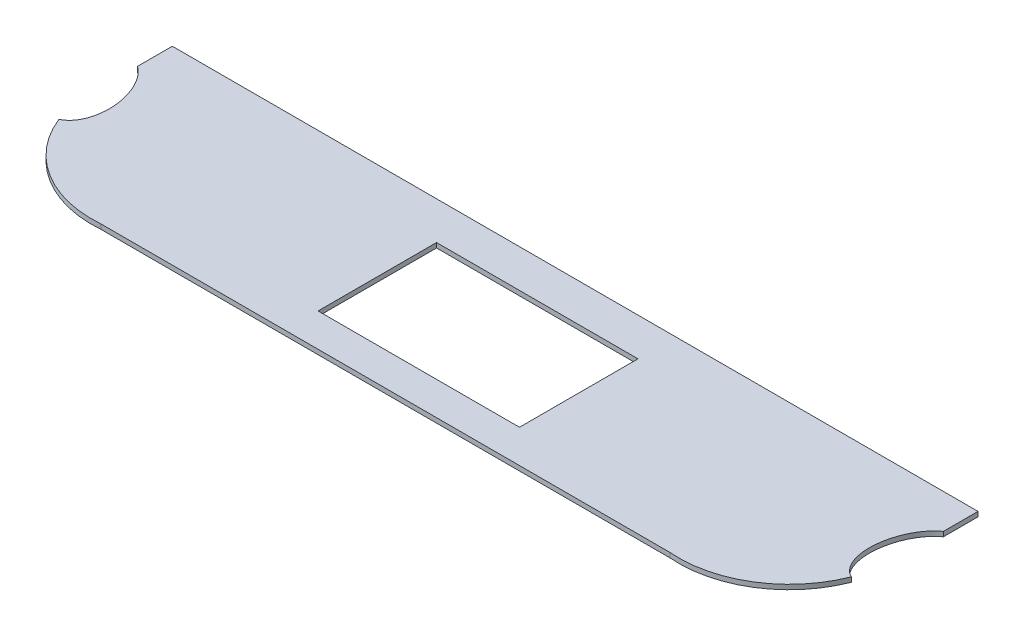
ISO-10303-21;
HEADER;
FILE_DESCRIPTION(('STEP AP214'),'2;1');
FILE_NAME('part.step','',(''),(''),'','','');
FILE_SCHEMA(('AUTOMOTIVE_DESIGN { 1 0 10303 214 1 1 1 1 }'));
ENDSEC;
DATA;
#1=APPLICATION_CONTEXT('core data for automotive mechanical design processes');
#2=APPLICATION_PROTOCOL_DEFINITION('international standard','automotive_design',2000,#1);
#3=PRODUCT_CONTEXT('',#1,'mechanical');
#4=PRODUCT('Part','Part','',(#3));
#5=PRODUCT_RELATED_PRODUCT_CATEGORY('part','',(#4));
#6=PRODUCT_DEFINITION_FORMATION('','',#4);
#7=PRODUCT_DEFINITION_CONTEXT('part definition',#1,'design');
#8=PRODUCT_DEFINITION('design','',#6,#7);
#9=PRODUCT_DEFINITION_SHAPE('','',#8);
#10=(LENGTH_UNIT() NAMED_UNIT(*) SI_UNIT(.MILLI.,.METRE.));
#11=(NAMED_UNIT(*) PLANE_ANGLE_UNIT() SI_UNIT($,.RADIAN.));
#12=(NAMED_UNIT(*) SI_UNIT($,.STERADIAN.) SOLID_ANGLE_UNIT());
#13=UNCERTAINTY_MEASURE_WITH_UNIT(LENGTH_MEASURE(1.E-05),#10,'distance_accuracy_value','');
#14=(GEOMETRIC_REPRESENTATION_CONTEXT(3) GLOBAL_UNCERTAINTY_ASSIGNED_CONTEXT((#13)) GLOBAL_UNIT_ASSIGNED_CONTEXT((#10,
#11,#12)) REPRESENTATION_CONTEXT('',''));
#15=CARTESIAN_POINT('',(0.,0.,0.));
#16=DIRECTION('',(0.,0.,1.));
#17=DIRECTION('',(1.,0.,0.));
#18=AXIS2_PLACEMENT_3D('',#15,#16,#17);
#19=CARTESIAN_POINT('',(157.295067766693,2.54,6.44379470696514));
#20=DIRECTION('',(0.,-1.,0.));
#21=DIRECTION('',(0.,0.,-1.));
#22=AXIS2_PLACEMENT_3D('',#19,#20,#21);
#23=CYLINDRICAL_SURFACE('',#22,59.17148954283);
#24=DIRECTION('',(0.,1.,0.));
#25=VECTOR('',#24,1.);
#26=CARTESIAN_POINT('',(212.346855170093,0.,28.1363251819493));
#27=LINE('',#26,#25);
#28=CARTESIAN_POINT('',(212.346855170093,0.,28.1363251819493));
#29=VERTEX_POINT('',#28);
#30=CARTESIAN_POINT('',(212.346855170093,2.54,28.1363251819493));
#31=VERTEX_POINT('',#30);
#32=EDGE_CURVE('E56',#29,#31,#27,.T.);
#33=ORIENTED_EDGE('',*,*,#32,.T.);
#34=CARTESIAN_POINT('',(157.295067766693,2.54,6.44379470696514));
#35=DIRECTION('',(0.,1.,0.));
#36=DIRECTION('',(0.,0.,-1.));
#37=AXIS2_PLACEMENT_3D('',#34,#35,#36);
#38=CIRCLE('',#37,59.17148954283);
#39=CARTESIAN_POINT('',(152.4,2.54,65.4124599985988));
#40=VERTEX_POINT('',#39);
#41=EDGE_CURVE('E156',#40,#31,#38,.T.);
#42=ORIENTED_EDGE('',*,*,#41,.F.);
#43=DIRECTION('',(0.,-1.,0.));
#44=VECTOR('',#43,1.);
#45=CARTESIAN_POINT('',(152.4,2.54,65.4124599985988));
#46=LINE('',#45,#44);
#47=CARTESIAN_POINT('',(152.4,0.,65.4124599985988));
#48=VERTEX_POINT('',#47);
#49=EDGE_CURVE('E157',#40,#48,#46,.T.);
#50=ORIENTED_EDGE('',*,*,#49,.T.);
#51=CARTESIAN_POINT('',(157.295067766693,0.,6.44379470696514));
#52=DIRECTION('',(0.,1.,0.));
#53=DIRECTION('',(0.,0.,-1.));
#54=AXIS2_PLACEMENT_3D('',#51,#52,#53);
#55=CIRCLE('',#54,59.17148954283);
#56=EDGE_CURVE('E142',#48,#29,#55,.T.);
#57=ORIENTED_EDGE('',*,*,#56,.T.);
#58=EDGE_LOOP('',(#33,#42,#50,#57));
#59=FACE_BOUND('',#58,.T.);
#60=ADVANCED_FACE('F34',(#59),#23,.T.);
#61=CARTESIAN_POINT('',(215.9,2.54,14.6124599985988));
#62=DIRECTION('',(-1.,0.,0.));
#63=DIRECTION('',(0.,0.,1.));
#64=AXIS2_PLACEMENT_3D('',#61,#62,#63);
#65=PLANE('',#64);
#66=DIRECTION('',(0.,1.,0.));
#67=VECTOR('',#66,1.);
#68=CARTESIAN_POINT('',(215.9,0.,-17.6025960449302));
#69=LINE('',#68,#67);
#70=CARTESIAN_POINT('',(215.9,0.,-17.6025960449302));
#71=VERTEX_POINT('',#70);
#72=CARTESIAN_POINT('',(215.9,2.54,-17.6025960449302));
#73=VERTEX_POINT('',#72);
#74=EDGE_CURVE('E122',#71,#73,#69,.T.);
#75=ORIENTED_EDGE('',*,*,#74,.F.);
#76=DIRECTION('',(0.,0.,-1.));
#77=VECTOR('',#76,1.);
#78=CARTESIAN_POINT('',(215.9,0.,14.6124599985988));
#79=LINE('',#78,#77);
#80=CARTESIAN_POINT('',(215.9,0.,-36.1875400014012));
#81=VERTEX_POINT('',#80);
#82=EDGE_CURVE('E134',#71,#81,#79,.T.);
#83=ORIENTED_EDGE('',*,*,#82,.T.);
#84=DIRECTION('',(0.,-1.,0.));
#85=VECTOR('',#84,1.);
#86=CARTESIAN_POINT('',(215.9,2.54,-36.1875400014012));
#87=LINE('',#86,#85);
#88=CARTESIAN_POINT('',(215.9,2.54,-36.1875400014012));
#89=VERTEX_POINT('',#88);
#90=EDGE_CURVE('E11',#89,#81,#87,.T.);
#91=ORIENTED_EDGE('',*,*,#90,.F.);
#92=DIRECTION('',(0.,0.,-1.));
#93=VECTOR('',#92,1.);
#94=CARTESIAN_POINT('',(215.9,2.54,14.6124599985988));
#95=LINE('',#94,#93);
#96=EDGE_CURVE('E135',#73,#89,#95,.T.);
#97=ORIENTED_EDGE('',*,*,#96,.F.);
#98=EDGE_LOOP('',(#75,#83,#91,#97));
#99=FACE_BOUND('',#98,.T.);
#100=ADVANCED_FACE('F132',(#99),#65,.F.);
#101=CARTESIAN_POINT('',(-215.9,2.54,14.6124599985989));
#102=DIRECTION('',(1.,0.,0.));
#103=DIRECTION('',(0.,0.,-1.));
#104=AXIS2_PLACEMENT_3D('',#101,#102,#103);
#105=PLANE('',#104);
#106=DIRECTION('',(0.,1.,0.));
#107=VECTOR('',#106,1.);
#108=CARTESIAN_POINT('',(-215.9,0.,-17.5351155177204));
#109=LINE('',#108,#107);
#110=CARTESIAN_POINT('',(-215.9,0.,-17.5351155177204));
#111=VERTEX_POINT('',#110);
#112=CARTESIAN_POINT('',(-215.9,2.54,-17.5351155177204));
#113=VERTEX_POINT('',#112);
#114=EDGE_CURVE('E48',#111,#113,#109,.T.);
#115=ORIENTED_EDGE('',*,*,#114,.T.);
#116=DIRECTION('',(0.,0.,1.));
#117=VECTOR('',#116,1.);
#118=CARTESIAN_POINT('',(-215.9,2.54,14.6124599985989));
#119=LINE('',#118,#117);
#120=CARTESIAN_POINT('',(-215.9,2.54,-36.1875400014012));
#121=VERTEX_POINT('',#120);
#122=EDGE_CURVE('E169',#121,#113,#119,.T.);
#123=ORIENTED_EDGE('',*,*,#122,.F.);
#124=DIRECTION('',(0.,-1.,0.));
#125=VECTOR('',#124,1.);
#126=CARTESIAN_POINT('',(-215.9,2.54,-36.1875400014012));
#127=LINE('',#126,#125);
#128=CARTESIAN_POINT('',(-215.9,0.,-36.1875400014012));
#129=VERTEX_POINT('',#128);
#130=EDGE_CURVE('E41',#121,#129,#127,.T.);
#131=ORIENTED_EDGE('',*,*,#130,.T.);
#132=DIRECTION('',(0.,0.,1.));
#133=VECTOR('',#132,1.);
#134=CARTESIAN_POINT('',(-215.9,0.,14.6124599985989));
#135=LINE('',#134,#133);
#136=EDGE_CURVE('E144',#129,#111,#135,.T.);
#137=ORIENTED_EDGE('',*,*,#136,.T.);
#138=EDGE_LOOP('',(#115,#123,#131,#137));
#139=FACE_BOUND('',#138,.T.);
#140=ADVANCED_FACE('F167',(#139),#105,.F.);
#141=CARTESIAN_POINT('',(-157.295067766693,2.54,6.44379470696514));
#142=DIRECTION('',(0.,-1.,0.));
#143=DIRECTION('',(0.,0.,-1.));
#144=AXIS2_PLACEMENT_3D('',#141,#142,#143);
#145=CYLINDRICAL_SURFACE('',#144,59.17148954283);
#146=DIRECTION('',(0.,1.,0.));
#147=VECTOR('',#146,1.);
#148=CARTESIAN_POINT('',(-212.355105742153,0.,28.1153750106289));
#149=LINE('',#148,#147);
#150=CARTESIAN_POINT('',(-212.355105742153,0.,28.1153750106289));
#151=VERTEX_POINT('',#150);
#152=CARTESIAN_POINT('',(-212.355105742153,2.54,28.1153750106289));
#153=VERTEX_POINT('',#152);
#154=EDGE_CURVE('E178',#151,#153,#149,.T.);
#155=ORIENTED_EDGE('',*,*,#154,.F.);
#156=CARTESIAN_POINT('',(-157.295067766693,0.,6.44379470696514));
#157=DIRECTION('',(0.,1.,0.));
#158=DIRECTION('',(0.,0.,-1.));
#159=AXIS2_PLACEMENT_3D('',#156,#157,#158);
#160=CIRCLE('',#159,59.17148954283);
#161=CARTESIAN_POINT('',(-152.4,0.,65.4124599985988));
#162=VERTEX_POINT('',#161);
#163=EDGE_CURVE('E152',#151,#162,#160,.T.);
#164=ORIENTED_EDGE('',*,*,#163,.T.);
#165=DIRECTION('',(0.,-1.,0.));
#166=VECTOR('',#165,1.);
#167=CARTESIAN_POINT('',(-152.4,2.54,65.4124599985988));
#168=LINE('',#167,#166);
#169=CARTESIAN_POINT('',(-152.4,2.54,65.4124599985988));
#170=VERTEX_POINT('',#169);
#171=EDGE_CURVE('E160',#170,#162,#168,.T.);
#172=ORIENTED_EDGE('',*,*,#171,.F.);
#173=CARTESIAN_POINT('',(-157.295067766693,2.54,6.44379470696514));
#174=DIRECTION('',(0.,1.,0.));
#175=DIRECTION('',(0.,0.,-1.));
#176=AXIS2_PLACEMENT_3D('',#173,#174,#175);
#177=CIRCLE('',#176,59.17148954283);
#178=EDGE_CURVE('E253',#153,#170,#177,.T.);
#179=ORIENTED_EDGE('',*,*,#178,.F.);
#180=EDGE_LOOP('',(#155,#164,#172,#179));
#181=FACE_BOUND('',#180,.T.);
#182=ADVANCED_FACE('F217',(#181),#145,.T.);
#183=CARTESIAN_POINT('',(157.295067766693,2.54,6.44379470696514));
#184=DIRECTION('',(0.,-1.,0.));
#185=DIRECTION('',(0.,0.,-1.));
#186=AXIS2_PLACEMENT_3D('',#183,#184,#185);
#187=PLANE('',#186);
#188=DIRECTION('',(1.,0.,0.));
#189=VECTOR('',#188,1.);
#190=CARTESIAN_POINT('',(53.9749999999999,2.54,47.625));
#191=LINE('',#190,#189);
#192=CARTESIAN_POINT('',(-53.9750000000001,2.54,47.625));
#193=VERTEX_POINT('',#192);
#194=CARTESIAN_POINT('',(53.9749999999999,2.54,47.625));
#195=VERTEX_POINT('',#194);
#196=EDGE_CURVE('E272',#193,#195,#191,.T.);
#197=ORIENTED_EDGE('',*,*,#196,.F.);
#198=DIRECTION('',(0.,0.,1.));
#199=VECTOR('',#198,1.);
#200=CARTESIAN_POINT('',(-53.9750000000001,2.54,47.625));
#201=LINE('',#200,#199);
#202=CARTESIAN_POINT('',(-53.9750000000001,2.54,-15.875));
#203=VERTEX_POINT('',#202);
#204=EDGE_CURVE('E136',#203,#193,#201,.T.);
#205=ORIENTED_EDGE('',*,*,#204,.F.);
#206=DIRECTION('',(-1.,0.,0.));
#207=VECTOR('',#206,1.);
#208=CARTESIAN_POINT('',(53.9749999999999,2.54,-15.875));
#209=LINE('',#208,#207);
#210=CARTESIAN_POINT('',(53.9749999999999,2.54,-15.875));
#211=VERTEX_POINT('',#210);
#212=EDGE_CURVE('E262',#211,#203,#209,.T.);
#213=ORIENTED_EDGE('',*,*,#212,.F.);
#214=DIRECTION('',(0.,0.,-1.));
#215=VECTOR('',#214,1.);
#216=CARTESIAN_POINT('',(53.9749999999999,2.54,47.625));
#217=LINE('',#216,#215);
#218=EDGE_CURVE('E275',#195,#211,#217,.T.);
#219=ORIENTED_EDGE('',*,*,#218,.F.);
#220=EDGE_LOOP('',(#197,#205,#213,#219));
#221=FACE_BOUND('',#220,.T.);
#222=CARTESIAN_POINT('',(214.41802753861,2.54,28.8587815019102));
#223=CARTESIAN_POINT('',(214.042953761031,2.54,28.7701865422077));
#224=CARTESIAN_POINT('',(213.302178044824,2.54,28.5533202004706));
#225=CARTESIAN_POINT('',(211.76152730083,2.54,27.907001916304));
#226=CARTESIAN_POINT('',(209.825715205948,2.54,26.6668951597427));
#227=CARTESIAN_POINT('',(207.642778210325,2.54,24.3782440730829));
#228=CARTESIAN_POINT('',(205.769429419579,2.54,21.2247631860449));
#229=CARTESIAN_POINT('',(204.364219868056,2.54,17.1685261295281));
#230=CARTESIAN_POINT('',(203.602011313653,2.54,12.2511470174635));
#231=CARTESIAN_POINT('',(203.646262202064,2.54,6.66908899947179));
#232=CARTESIAN_POINT('',(204.584578871519,2.54,0.799601085276111));
#233=CARTESIAN_POINT('',(206.371728131496,2.54,-4.86938683759238));
#234=CARTESIAN_POINT('',(208.829838854302,2.54,-9.88127485826684));
#235=CARTESIAN_POINT('',(211.711764264888,2.54,-13.937884913472));
#236=CARTESIAN_POINT('',(214.783414722827,2.54,-16.936657396771));
#237=CARTESIAN_POINT('',(217.86978949909,2.54,-18.9186180767932));
#238=CARTESIAN_POINT('',(220.846064988478,2.54,-19.9886283265558));
#239=CARTESIAN_POINT('',(223.132164490553,2.54,-20.2314910469839));
#240=CARTESIAN_POINT('',(224.799177514852,2.54,-20.1201374828919));
#241=CARTESIAN_POINT('',(225.938456606011,2.54,-19.9138672372823));
#242=CARTESIAN_POINT('',(227.049620180322,2.54,-19.5885677246767));
#243=CARTESIAN_POINT('',(228.590270924316,2.54,-18.9422494405101));
#244=CARTESIAN_POINT('',(230.526083019198,2.54,-17.7021426839489));
#245=CARTESIAN_POINT('',(232.709020014821,2.54,-15.413491597289));
#246=CARTESIAN_POINT('',(234.582368805568,2.54,-12.2600107102511));
#247=CARTESIAN_POINT('',(235.987578357091,2.54,-8.20377365373422));
#248=CARTESIAN_POINT('',(236.749786911494,2.54,-3.28639454166966));
#249=CARTESIAN_POINT('',(236.705536023082,2.54,2.29566347632208));
#250=CARTESIAN_POINT('',(235.767219353627,2.54,8.16515139051775));
#251=CARTESIAN_POINT('',(233.98007009365,2.54,13.8341393133862));
#252=CARTESIAN_POINT('',(231.521959370845,2.54,18.8460273340607));
#253=CARTESIAN_POINT('',(228.640033960258,2.54,22.9026373892659));
#254=CARTESIAN_POINT('',(225.568383502319,2.54,25.9014098725648));
#255=CARTESIAN_POINT('',(222.482008726056,2.54,27.8833705525871));
#256=CARTESIAN_POINT('',(219.505733236668,2.54,28.9533808023497));
#257=CARTESIAN_POINT('',(217.219633734593,2.54,29.1962435227778));
#258=CARTESIAN_POINT('',(215.552620710295,2.54,29.0848899586857));
#259=CARTESIAN_POINT('',(214.793101316188,2.54,28.9473764616127));
#260=CARTESIAN_POINT('',(214.41802753861,2.54,28.8587815019102));
#261=B_SPLINE_CURVE_WITH_KNOTS('',3,(#222,#223,#224,#225,#226,#227,#228,#229,#230,#231,#232,
#233,#234,#235,#236,#237,#238,#239,#240,#241,#242,#243,#244,#245,#246,#247,#248,#249,#250,#251,
#252,#253,#254,#255,#256,#257,#258,#259,#260),.UNSPECIFIED.,.T.,.F.,(4,1,1,1,1,1,1,1,1,1,1,1,1,
1,1,1,1,1,1,1,1,1,1,1,1,1,1,1,1,1,1,1,1,1,1,1,4),(0.,0.015625,0.03125,0.0625,0.09375,0.125,
0.15625,0.1875,0.21875,0.25,0.28125,0.3125,0.34375,0.375,0.40625,0.4375,0.46875,0.484375,0.5,
0.515625,0.53125,0.5625,0.59375,0.625,0.65625,0.6875,0.71875,0.75,0.78125,0.8125,0.84375,0.875,
0.90625,0.9375,0.96875,0.984375,1.),.UNSPECIFIED.);
#262=EDGE_CURVE('E128',#31,#73,#261,.T.);
#263=ORIENTED_EDGE('',*,*,#262,.T.);
#264=ORIENTED_EDGE('',*,*,#96,.T.);
#265=DIRECTION('',(-1.,0.,0.));
#266=VECTOR('',#265,1.);
#267=CARTESIAN_POINT('',(215.9,2.54,-36.1875400014012));
#268=LINE('',#267,#266);
#269=EDGE_CURVE('E245',#89,#121,#268,.T.);
#270=ORIENTED_EDGE('',*,*,#269,.T.);
#271=ORIENTED_EDGE('',*,*,#122,.T.);
#272=CARTESIAN_POINT('',(-226.051095403651,2.54,-19.890095067584));
#273=CARTESIAN_POINT('',(-225.676136672233,2.54,-19.9793031638386));
#274=CARTESIAN_POINT('',(-224.916780090115,2.54,-20.1180449283479));
#275=CARTESIAN_POINT('',(-223.249816640436,2.54,-20.2320332954114));
#276=CARTESIAN_POINT('',(-220.963170707042,2.54,-19.99266166076));
#277=CARTESIAN_POINT('',(-217.98505413584,2.54,-18.9270251984518));
#278=CARTESIAN_POINT('',(-214.895413966226,2.54,-16.9494572020002));
#279=CARTESIAN_POINT('',(-211.818837240113,2.54,-13.9548850455778));
#280=CARTESIAN_POINT('',(-208.930212320968,2.54,-9.90197838427497));
#281=CARTESIAN_POINT('',(-206.463783195008,2.54,-4.89293377605637));
#282=CARTESIAN_POINT('',(-204.667192604217,2.54,0.774398823719046));
#283=CARTESIAN_POINT('',(-203.719076256733,2.54,6.64359569714467));
#284=CARTESIAN_POINT('',(-203.665482887653,2.54,12.226688770997));
#285=CARTESIAN_POINT('',(-204.419435916413,2.54,17.146217321495));
#286=CARTESIAN_POINT('',(-205.817811739389,2.54,21.2054453034386));
#287=CARTESIAN_POINT('',(-207.685847242087,2.54,24.3625159264921));
#288=CARTESIAN_POINT('',(-209.864985661102,2.54,26.6551378168691));
#289=CARTESIAN_POINT('',(-211.798837632187,2.54,27.8986268430038));
#290=CARTESIAN_POINT('',(-213.338532650553,2.54,28.5475488266109));
#291=CARTESIAN_POINT('',(-214.449250165883,2.54,28.8746847573746));
#292=CARTESIAN_POINT('',(-215.58828503906,2.54,29.0827974041385));
#293=CARTESIAN_POINT('',(-217.255248488738,2.54,29.1967857712019));
#294=CARTESIAN_POINT('',(-219.541894422133,2.54,28.9574141365506));
#295=CARTESIAN_POINT('',(-222.520010993334,2.54,27.8917776742423));
#296=CARTESIAN_POINT('',(-225.609651162949,2.54,25.9142096777908));
#297=CARTESIAN_POINT('',(-228.686227889062,2.54,22.9196375213684));
#298=CARTESIAN_POINT('',(-231.574852808207,2.54,18.8667308600656));
#299=CARTESIAN_POINT('',(-234.041281934167,2.54,13.8576862518469));
#300=CARTESIAN_POINT('',(-235.837872524958,2.54,8.19035365207153));
#301=CARTESIAN_POINT('',(-236.785988872442,2.54,2.32115677864591));
#302=CARTESIAN_POINT('',(-236.839582241521,2.54,-3.26193629520646));
#303=CARTESIAN_POINT('',(-236.085629212762,2.54,-8.18146484570444));
#304=CARTESIAN_POINT('',(-234.687253389785,2.54,-12.240692827648));
#305=CARTESIAN_POINT('',(-232.819217887088,2.54,-15.3977634507015));
#306=CARTESIAN_POINT('',(-230.640079468073,2.54,-17.6903853410785));
#307=CARTESIAN_POINT('',(-228.706227496988,2.54,-18.9338743672132));
#308=CARTESIAN_POINT('',(-227.166532478622,2.54,-19.5827963508203));
#309=CARTESIAN_POINT('',(-226.426054135069,2.54,-19.8008869713294));
#310=CARTESIAN_POINT('',(-226.051095403651,2.54,-19.890095067584));
#311=B_SPLINE_CURVE_WITH_KNOTS('',3,(#272,#273,#274,#275,#276,#277,#278,#279,#280,#281,#282,
#283,#284,#285,#286,#287,#288,#289,#290,#291,#292,#293,#294,#295,#296,#297,#298,#299,#300,#301,
#302,#303,#304,#305,#306,#307,#308,#309,#310),.UNSPECIFIED.,.T.,.F.,(4,1,1,1,1,1,1,1,1,1,1,1,1,
1,1,1,1,1,1,1,1,1,1,1,1,1,1,1,1,1,1,1,1,1,1,1,4),(0.,0.015625,0.03125,0.0625,0.09375,0.125,
0.15625,0.1875,0.21875,0.25,0.28125,0.3125,0.34375,0.375,0.40625,0.4375,0.46875,0.484375,0.5,
0.515625,0.53125,0.5625,0.59375,0.625,0.65625,0.6875,0.71875,0.75,0.78125,0.8125,0.84375,0.875,
0.90625,0.9375,0.96875,0.984375,1.),.UNSPECIFIED.);
#312=EDGE_CURVE('E176',#113,#153,#311,.T.);
#313=ORIENTED_EDGE('',*,*,#312,.T.);
#314=ORIENTED_EDGE('',*,*,#178,.T.);
#315=DIRECTION('',(1.,0.,0.));
#316=VECTOR('',#315,1.);
#317=CARTESIAN_POINT('',(152.4,2.54,65.4124599985988));
#318=LINE('',#317,#316);
#319=EDGE_CURVE('E161',#170,#40,#318,.T.);
#320=ORIENTED_EDGE('',*,*,#319,.T.);
#321=ORIENTED_EDGE('',*,*,#41,.T.);
#322=EDGE_LOOP('',(#263,#264,#270,#271,#313,#314,#320,#321));
#323=FACE_BOUND('',#322,.T.);
#324=ADVANCED_FACE('F214',(#221,#323),#187,.F.);
#325=CARTESIAN_POINT('',(157.295067766693,0.,6.44379470696514));
#326=DIRECTION('',(0.,-1.,0.));
#327=DIRECTION('',(0.,0.,-1.));
#328=AXIS2_PLACEMENT_3D('',#325,#326,#327);
#329=PLANE('',#328);
#330=DIRECTION('',(0.,0.,1.));
#331=VECTOR('',#330,1.);
#332=CARTESIAN_POINT('',(-53.9750000000001,0.,47.625));
#333=LINE('',#332,#331);
#334=CARTESIAN_POINT('',(-53.9750000000001,0.,-15.875));
#335=VERTEX_POINT('',#334);
#336=CARTESIAN_POINT('',(-53.9750000000001,0.,47.625));
#337=VERTEX_POINT('',#336);
#338=EDGE_CURVE('E258',#335,#337,#333,.T.);
#339=ORIENTED_EDGE('',*,*,#338,.T.);
#340=DIRECTION('',(1.,0.,0.));
#341=VECTOR('',#340,1.);
#342=CARTESIAN_POINT('',(53.9749999999999,0.,47.625));
#343=LINE('',#342,#341);
#344=CARTESIAN_POINT('',(53.9749999999999,0.,47.625));
#345=VERTEX_POINT('',#344);
#346=EDGE_CURVE('E261',#337,#345,#343,.T.);
#347=ORIENTED_EDGE('',*,*,#346,.T.);
#348=DIRECTION('',(0.,0.,-1.));
#349=VECTOR('',#348,1.);
#350=CARTESIAN_POINT('',(53.9749999999999,0.,47.625));
#351=LINE('',#350,#349);
#352=CARTESIAN_POINT('',(53.9749999999999,0.,-15.875));
#353=VERTEX_POINT('',#352);
#354=EDGE_CURVE('E265',#345,#353,#351,.T.);
#355=ORIENTED_EDGE('',*,*,#354,.T.);
#356=DIRECTION('',(-1.,0.,0.));
#357=VECTOR('',#356,1.);
#358=CARTESIAN_POINT('',(53.9749999999999,0.,-15.875));
#359=LINE('',#358,#357);
#360=EDGE_CURVE('E268',#353,#335,#359,.T.);
#361=ORIENTED_EDGE('',*,*,#360,.T.);
#362=EDGE_LOOP('',(#339,#347,#355,#361));
#363=FACE_BOUND('',#362,.T.);
#364=ORIENTED_EDGE('',*,*,#82,.F.);
#365=CARTESIAN_POINT('',(214.41802753861,0.,28.8587815019102));
#366=CARTESIAN_POINT('',(214.042953761031,0.,28.7701865422077));
#367=CARTESIAN_POINT('',(213.302178044824,0.,28.5533202004706));
#368=CARTESIAN_POINT('',(211.76152730083,0.,27.907001916304));
#369=CARTESIAN_POINT('',(209.825715205948,0.,26.6668951597427));
#370=CARTESIAN_POINT('',(207.642778210325,0.,24.3782440730829));
#371=CARTESIAN_POINT('',(205.769429419579,0.,21.2247631860449));
#372=CARTESIAN_POINT('',(204.364219868056,0.,17.1685261295281));
#373=CARTESIAN_POINT('',(203.602011313653,0.,12.2511470174635));
#374=CARTESIAN_POINT('',(203.646262202064,0.,6.66908899947179));
#375=CARTESIAN_POINT('',(204.584578871519,0.,0.799601085276111));
#376=CARTESIAN_POINT('',(206.371728131496,0.,-4.86938683759238));
#377=CARTESIAN_POINT('',(208.829838854302,0.,-9.88127485826684));
#378=CARTESIAN_POINT('',(211.711764264888,0.,-13.937884913472));
#379=CARTESIAN_POINT('',(214.783414722827,0.,-16.936657396771));
#380=CARTESIAN_POINT('',(217.86978949909,0.,-18.9186180767932));
#381=CARTESIAN_POINT('',(220.846064988478,0.,-19.9886283265558));
#382=CARTESIAN_POINT('',(223.132164490553,0.,-20.2314910469839));
#383=CARTESIAN_POINT('',(224.799177514852,0.,-20.1201374828919));
#384=CARTESIAN_POINT('',(225.938456606011,0.,-19.9138672372823));
#385=CARTESIAN_POINT('',(227.049620180322,0.,-19.5885677246767));
#386=CARTESIAN_POINT('',(228.590270924316,0.,-18.9422494405101));
#387=CARTESIAN_POINT('',(230.526083019198,0.,-17.7021426839489));
#388=CARTESIAN_POINT('',(232.709020014821,0.,-15.413491597289));
#389=CARTESIAN_POINT('',(234.582368805568,0.,-12.2600107102511));
#390=CARTESIAN_POINT('',(235.987578357091,0.,-8.20377365373422));
#391=CARTESIAN_POINT('',(236.749786911494,0.,-3.28639454166966));
#392=CARTESIAN_POINT('',(236.705536023082,0.,2.29566347632208));
#393=CARTESIAN_POINT('',(235.767219353627,0.,8.16515139051775));
#394=CARTESIAN_POINT('',(233.98007009365,0.,13.8341393133862));
#395=CARTESIAN_POINT('',(231.521959370845,0.,18.8460273340607));
#396=CARTESIAN_POINT('',(228.640033960258,0.,22.9026373892659));
#397=CARTESIAN_POINT('',(225.568383502319,0.,25.9014098725648));
#398=CARTESIAN_POINT('',(222.482008726056,0.,27.8833705525871));
#399=CARTESIAN_POINT('',(219.505733236668,0.,28.9533808023497));
#400=CARTESIAN_POINT('',(217.219633734593,0.,29.1962435227778));
#401=CARTESIAN_POINT('',(215.552620710295,0.,29.0848899586857));
#402=CARTESIAN_POINT('',(214.793101316188,0.,28.9473764616127));
#403=CARTESIAN_POINT('',(214.41802753861,0.,28.8587815019102));
#404=B_SPLINE_CURVE_WITH_KNOTS('',3,(#365,#366,#367,#368,#369,#370,#371,#372,#373,#374,#375,
#376,#377,#378,#379,#380,#381,#382,#383,#384,#385,#386,#387,#388,#389,#390,#391,#392,#393,#394,
#395,#396,#397,#398,#399,#400,#401,#402,#403),.UNSPECIFIED.,.T.,.F.,(4,1,1,1,1,1,1,1,1,1,1,1,1,
1,1,1,1,1,1,1,1,1,1,1,1,1,1,1,1,1,1,1,1,1,1,1,4),(0.,0.015625,0.03125,0.0625,0.09375,0.125,
0.15625,0.1875,0.21875,0.25,0.28125,0.3125,0.34375,0.375,0.40625,0.4375,0.46875,0.484375,0.5,
0.515625,0.53125,0.5625,0.59375,0.625,0.65625,0.6875,0.71875,0.75,0.78125,0.8125,0.84375,0.875,
0.90625,0.9375,0.96875,0.984375,1.),.UNSPECIFIED.);
#405=EDGE_CURVE('E119',#29,#71,#404,.T.);
#406=ORIENTED_EDGE('',*,*,#405,.F.);
#407=ORIENTED_EDGE('',*,*,#56,.F.);
#408=DIRECTION('',(1.,0.,0.));
#409=VECTOR('',#408,1.);
#410=CARTESIAN_POINT('',(152.4,0.,65.4124599985988));
#411=LINE('',#410,#409);
#412=EDGE_CURVE('E154',#162,#48,#411,.T.);
#413=ORIENTED_EDGE('',*,*,#412,.F.);
#414=ORIENTED_EDGE('',*,*,#163,.F.);
#415=CARTESIAN_POINT('',(-226.051095403651,0.,-19.890095067584));
#416=CARTESIAN_POINT('',(-225.676136672233,0.,-19.9793031638386));
#417=CARTESIAN_POINT('',(-224.916780090115,0.,-20.1180449283479));
#418=CARTESIAN_POINT('',(-223.249816640436,0.,-20.2320332954114));
#419=CARTESIAN_POINT('',(-220.963170707042,0.,-19.99266166076));
#420=CARTESIAN_POINT('',(-217.98505413584,0.,-18.9270251984518));
#421=CARTESIAN_POINT('',(-214.895413966226,0.,-16.9494572020002));
#422=CARTESIAN_POINT('',(-211.818837240113,0.,-13.9548850455778));
#423=CARTESIAN_POINT('',(-208.930212320968,0.,-9.90197838427497));
#424=CARTESIAN_POINT('',(-206.463783195008,0.,-4.89293377605637));
#425=CARTESIAN_POINT('',(-204.667192604217,0.,0.774398823719046));
#426=CARTESIAN_POINT('',(-203.719076256733,0.,6.64359569714467));
#427=CARTESIAN_POINT('',(-203.665482887653,0.,12.226688770997));
#428=CARTESIAN_POINT('',(-204.419435916413,0.,17.146217321495));
#429=CARTESIAN_POINT('',(-205.817811739389,0.,21.2054453034386));
#430=CARTESIAN_POINT('',(-207.685847242087,0.,24.3625159264921));
#431=CARTESIAN_POINT('',(-209.864985661102,0.,26.6551378168691));
#432=CARTESIAN_POINT('',(-211.798837632187,0.,27.8986268430038));
#433=CARTESIAN_POINT('',(-213.338532650553,0.,28.5475488266109));
#434=CARTESIAN_POINT('',(-214.449250165883,0.,28.8746847573746));
#435=CARTESIAN_POINT('',(-215.58828503906,0.,29.0827974041385));
#436=CARTESIAN_POINT('',(-217.255248488738,0.,29.1967857712019));
#437=CARTESIAN_POINT('',(-219.541894422133,0.,28.9574141365506));
#438=CARTESIAN_POINT('',(-222.520010993334,0.,27.8917776742423));
#439=CARTESIAN_POINT('',(-225.609651162949,0.,25.9142096777908));
#440=CARTESIAN_POINT('',(-228.686227889062,0.,22.9196375213684));
#441=CARTESIAN_POINT('',(-231.574852808207,0.,18.8667308600656));
#442=CARTESIAN_POINT('',(-234.041281934167,0.,13.8576862518469));
#443=CARTESIAN_POINT('',(-235.837872524958,0.,8.19035365207153));
#444=CARTESIAN_POINT('',(-236.785988872442,0.,2.32115677864591));
#445=CARTESIAN_POINT('',(-236.839582241521,0.,-3.26193629520646));
#446=CARTESIAN_POINT('',(-236.085629212762,0.,-8.18146484570444));
#447=CARTESIAN_POINT('',(-234.687253389785,0.,-12.240692827648));
#448=CARTESIAN_POINT('',(-232.819217887088,0.,-15.3977634507015));
#449=CARTESIAN_POINT('',(-230.640079468073,0.,-17.6903853410785));
#450=CARTESIAN_POINT('',(-228.706227496988,0.,-18.9338743672132));
#451=CARTESIAN_POINT('',(-227.166532478622,0.,-19.5827963508203));
#452=CARTESIAN_POINT('',(-226.426054135069,0.,-19.8008869713294));
#453=CARTESIAN_POINT('',(-226.051095403651,0.,-19.890095067584));
#454=B_SPLINE_CURVE_WITH_KNOTS('',3,(#415,#416,#417,#418,#419,#420,#421,#422,#423,#424,#425,
#426,#427,#428,#429,#430,#431,#432,#433,#434,#435,#436,#437,#438,#439,#440,#441,#442,#443,#444,
#445,#446,#447,#448,#449,#450,#451,#452,#453),.UNSPECIFIED.,.T.,.F.,(4,1,1,1,1,1,1,1,1,1,1,1,1,
1,1,1,1,1,1,1,1,1,1,1,1,1,1,1,1,1,1,1,1,1,1,1,4),(0.,0.015625,0.03125,0.0625,0.09375,0.125,
0.15625,0.1875,0.21875,0.25,0.28125,0.3125,0.34375,0.375,0.40625,0.4375,0.46875,0.484375,0.5,
0.515625,0.53125,0.5625,0.59375,0.625,0.65625,0.6875,0.71875,0.75,0.78125,0.8125,0.84375,0.875,
0.90625,0.9375,0.96875,0.984375,1.),.UNSPECIFIED.);
#455=EDGE_CURVE('E173',#111,#151,#454,.T.);
#456=ORIENTED_EDGE('',*,*,#455,.F.);
#457=ORIENTED_EDGE('',*,*,#136,.F.);
#458=DIRECTION('',(-1.,0.,0.));
#459=VECTOR('',#458,1.);
#460=CARTESIAN_POINT('',(215.9,0.,-36.1875400014012));
#461=LINE('',#460,#459);
#462=EDGE_CURVE('E141',#81,#129,#461,.T.);
#463=ORIENTED_EDGE('',*,*,#462,.F.);
#464=EDGE_LOOP('',(#364,#406,#407,#413,#414,#456,#457,#463));
#465=FACE_BOUND('',#464,.T.);
#466=ADVANCED_FACE('F139',(#363,#465),#329,.T.);
#467=CARTESIAN_POINT('',(215.9,2.54,-36.1875400014012));
#468=DIRECTION('',(0.,0.,1.));
#469=DIRECTION('',(1.,0.,0.));
#470=AXIS2_PLACEMENT_3D('',#467,#468,#469);
#471=PLANE('',#470);
#472=ORIENTED_EDGE('',*,*,#462,.T.);
#473=ORIENTED_EDGE('',*,*,#130,.F.);
#474=ORIENTED_EDGE('',*,*,#269,.F.);
#475=ORIENTED_EDGE('',*,*,#90,.T.);
#476=EDGE_LOOP('',(#472,#473,#474,#475));
#477=FACE_BOUND('',#476,.T.);
#478=ADVANCED_FACE('F221',(#477),#471,.F.);
#479=CARTESIAN_POINT('',(152.4,2.54,65.4124599985988));
#480=DIRECTION('',(0.,0.,-1.));
#481=DIRECTION('',(-1.,0.,0.));
#482=AXIS2_PLACEMENT_3D('',#479,#480,#481);
#483=PLANE('',#482);
#484=ORIENTED_EDGE('',*,*,#412,.T.);
#485=ORIENTED_EDGE('',*,*,#49,.F.);
#486=ORIENTED_EDGE('',*,*,#319,.F.);
#487=ORIENTED_EDGE('',*,*,#171,.T.);
#488=EDGE_LOOP('',(#484,#485,#486,#487));
#489=FACE_BOUND('',#488,.T.);
#490=ADVANCED_FACE('F212',(#489),#483,.F.);
#491=CARTESIAN_POINT('',(-53.9750000000001,0.,47.625));
#492=DIRECTION('',(-1.,0.,0.));
#493=DIRECTION('',(0.,0.,1.));
#494=AXIS2_PLACEMENT_3D('',#491,#492,#493);
#495=PLANE('',#494);
#496=ORIENTED_EDGE('',*,*,#204,.T.);
#497=DIRECTION('',(0.,1.,0.));
#498=VECTOR('',#497,1.);
#499=CARTESIAN_POINT('',(-53.9750000000001,0.,47.625));
#500=LINE('',#499,#498);
#501=EDGE_CURVE('E248',#337,#193,#500,.T.);
#502=ORIENTED_EDGE('',*,*,#501,.F.);
#503=ORIENTED_EDGE('',*,*,#338,.F.);
#504=DIRECTION('',(0.,1.,0.));
#505=VECTOR('',#504,1.);
#506=CARTESIAN_POINT('',(-53.9750000000001,0.,-15.875));
#507=LINE('',#506,#505);
#508=EDGE_CURVE('E146',#335,#203,#507,.T.);
#509=ORIENTED_EDGE('',*,*,#508,.T.);
#510=EDGE_LOOP('',(#496,#502,#503,#509));
#511=FACE_BOUND('',#510,.T.);
#512=ADVANCED_FACE('F202',(#511),#495,.F.);
#513=CARTESIAN_POINT('',(53.9749999999999,0.,-15.875));
#514=DIRECTION('',(0.,0.,-1.));
#515=DIRECTION('',(-1.,0.,0.));
#516=AXIS2_PLACEMENT_3D('',#513,#514,#515);
#517=PLANE('',#516);
#518=ORIENTED_EDGE('',*,*,#212,.T.);
#519=ORIENTED_EDGE('',*,*,#508,.F.);
#520=ORIENTED_EDGE('',*,*,#360,.F.);
#521=DIRECTION('',(0.,1.,0.));
#522=VECTOR('',#521,1.);
#523=CARTESIAN_POINT('',(53.9749999999999,0.,-15.875));
#524=LINE('',#523,#522);
#525=EDGE_CURVE('E281',#353,#211,#524,.T.);
#526=ORIENTED_EDGE('',*,*,#525,.T.);
#527=EDGE_LOOP('',(#518,#519,#520,#526));
#528=FACE_BOUND('',#527,.T.);
#529=ADVANCED_FACE('F198',(#528),#517,.F.);
#530=CARTESIAN_POINT('',(53.9749999999999,0.,47.625));
#531=DIRECTION('',(1.,0.,0.));
#532=DIRECTION('',(0.,0.,-1.));
#533=AXIS2_PLACEMENT_3D('',#530,#531,#532);
#534=PLANE('',#533);
#535=ORIENTED_EDGE('',*,*,#218,.T.);
#536=ORIENTED_EDGE('',*,*,#525,.F.);
#537=ORIENTED_EDGE('',*,*,#354,.F.);
#538=DIRECTION('',(0.,1.,0.));
#539=VECTOR('',#538,1.);
#540=CARTESIAN_POINT('',(53.9749999999999,0.,47.625));
#541=LINE('',#540,#539);
#542=EDGE_CURVE('E282',#345,#195,#541,.T.);
#543=ORIENTED_EDGE('',*,*,#542,.T.);
#544=EDGE_LOOP('',(#535,#536,#537,#543));
#545=FACE_BOUND('',#544,.T.);
#546=ADVANCED_FACE('F201',(#545),#534,.F.);
#547=CARTESIAN_POINT('',(53.9749999999999,0.,47.625));
#548=DIRECTION('',(0.,0.,1.));
#549=DIRECTION('',(1.,0.,0.));
#550=AXIS2_PLACEMENT_3D('',#547,#548,#549);
#551=PLANE('',#550);
#552=ORIENTED_EDGE('',*,*,#196,.T.);
#553=ORIENTED_EDGE('',*,*,#542,.F.);
#554=ORIENTED_EDGE('',*,*,#346,.F.);
#555=ORIENTED_EDGE('',*,*,#501,.T.);
#556=EDGE_LOOP('',(#552,#553,#554,#555));
#557=FACE_BOUND('',#556,.T.);
#558=ADVANCED_FACE('F197',(#557),#551,.F.);
#559=DIRECTION('',(0.,1.,0.));
#560=VECTOR('',#559,1.);
#561=SURFACE_OF_LINEAR_EXTRUSION('',#454,#560);
#562=ORIENTED_EDGE('',*,*,#312,.F.);
#563=ORIENTED_EDGE('',*,*,#114,.F.);
#564=ORIENTED_EDGE('',*,*,#455,.T.);
#565=ORIENTED_EDGE('',*,*,#154,.T.);
#566=EDGE_LOOP('',(#562,#563,#564,#565));
#567=FACE_BOUND('',#566,.T.);
#568=ADVANCED_FACE('F193',(#567),#561,.T.);
#569=DIRECTION('',(0.,1.,0.));
#570=VECTOR('',#569,1.);
#571=SURFACE_OF_LINEAR_EXTRUSION('',#404,#570);
#572=ORIENTED_EDGE('',*,*,#262,.F.);
#573=ORIENTED_EDGE('',*,*,#32,.F.);
#574=ORIENTED_EDGE('',*,*,#405,.T.);
#575=ORIENTED_EDGE('',*,*,#74,.T.);
#576=EDGE_LOOP('',(#572,#573,#574,#575));
#577=FACE_BOUND('',#576,.T.);
#578=ADVANCED_FACE('F121',(#577),#571,.T.);
#579=CLOSED_SHELL('',(#60,#100,#140,#182,#324,#466,#478,#490,#512,#529,#546,#558,#568,#578));
#580=MANIFOLD_SOLID_BREP('B2',#579);
#581=ADVANCED_BREP_SHAPE_REPRESENTATION('',(#18,#580),#14);
#582=SHAPE_DEFINITION_REPRESENTATION(#9,#581);
ENDSEC;
END-ISO-10303-21;
